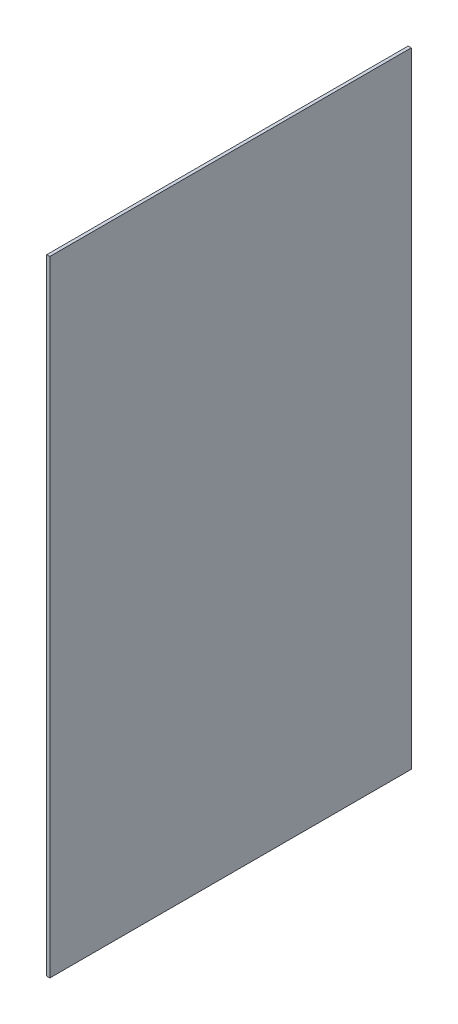
ISO-10303-21;
HEADER;
FILE_DESCRIPTION(('STEP AP214'),'2;1');
FILE_NAME('part.step','',(''),(''),'','','');
FILE_SCHEMA(('AUTOMOTIVE_DESIGN { 1 0 10303 214 1 1 1 1 }'));
ENDSEC;
DATA;
#1=APPLICATION_CONTEXT('core data for automotive mechanical design processes');
#2=APPLICATION_PROTOCOL_DEFINITION('international standard','automotive_design',2000,#1);
#3=PRODUCT_CONTEXT('',#1,'mechanical');
#4=PRODUCT('Part','Part','',(#3));
#5=PRODUCT_RELATED_PRODUCT_CATEGORY('part','',(#4));
#6=PRODUCT_DEFINITION_FORMATION('','',#4);
#7=PRODUCT_DEFINITION_CONTEXT('part definition',#1,'design');
#8=PRODUCT_DEFINITION('design','',#6,#7);
#9=PRODUCT_DEFINITION_SHAPE('','',#8);
#10=(LENGTH_UNIT() NAMED_UNIT(*) SI_UNIT(.MILLI.,.METRE.));
#11=(NAMED_UNIT(*) PLANE_ANGLE_UNIT() SI_UNIT($,.RADIAN.));
#12=(NAMED_UNIT(*) SI_UNIT($,.STERADIAN.) SOLID_ANGLE_UNIT());
#13=UNCERTAINTY_MEASURE_WITH_UNIT(LENGTH_MEASURE(1.E-05),#10,'distance_accuracy_value','');
#14=(GEOMETRIC_REPRESENTATION_CONTEXT(3) GLOBAL_UNCERTAINTY_ASSIGNED_CONTEXT((#13)) GLOBAL_UNIT_ASSIGNED_CONTEXT((#10,
#11,#12)) REPRESENTATION_CONTEXT('',''));
#15=CARTESIAN_POINT('',(0.,0.,0.));
#16=DIRECTION('',(0.,0.,1.));
#17=DIRECTION('',(1.,0.,0.));
#18=AXIS2_PLACEMENT_3D('',#15,#16,#17);
#19=CARTESIAN_POINT('',(3.4,-50.5656,30.16));
#20=DIRECTION('',(1.,0.,0.));
#21=DIRECTION('',(0.,0.,-1.));
#22=AXIS2_PLACEMENT_3D('',#19,#20,#21);
#23=PLANE('',#22);
#24=DIRECTION('',(0.,-1.,0.));
#25=VECTOR('',#24,1.);
#26=CARTESIAN_POINT('',(3.4,1.58,-29.));
#27=LINE('',#26,#25);
#28=CARTESIAN_POINT('',(3.4,-48.56,-29.));
#29=VERTEX_POINT('',#28);
#30=CARTESIAN_POINT('',(3.4,51.72,-29.));
#31=VERTEX_POINT('',#30);
#32=EDGE_CURVE('E76',#29,#31,#27,.F.);
#33=ORIENTED_EDGE('',*,*,#32,.T.);
#34=DIRECTION('',(0.,0.,-1.));
#35=VECTOR('',#34,1.);
#36=CARTESIAN_POINT('',(3.4,51.72,0.));
#37=LINE('',#36,#35);
#38=CARTESIAN_POINT('',(3.4,51.72,29.));
#39=VERTEX_POINT('',#38);
#40=EDGE_CURVE('E58',#31,#39,#37,.F.);
#41=ORIENTED_EDGE('',*,*,#40,.T.);
#42=DIRECTION('',(0.,1.,0.));
#43=VECTOR('',#42,1.);
#44=CARTESIAN_POINT('',(3.4,1.58,29.));
#45=LINE('',#44,#43);
#46=CARTESIAN_POINT('',(3.4,-48.56,29.));
#47=VERTEX_POINT('',#46);
#48=EDGE_CURVE('E20',#39,#47,#45,.F.);
#49=ORIENTED_EDGE('',*,*,#48,.T.);
#50=DIRECTION('',(0.,0.,1.));
#51=VECTOR('',#50,1.);
#52=CARTESIAN_POINT('',(3.4,-48.56,0.));
#53=LINE('',#52,#51);
#54=EDGE_CURVE('E55',#47,#29,#53,.F.);
#55=ORIENTED_EDGE('',*,*,#54,.T.);
#56=EDGE_LOOP('',(#33,#41,#49,#55));
#57=FACE_BOUND('',#56,.T.);
#58=ADVANCED_FACE('F16',(#57),#23,.T.);
#59=CARTESIAN_POINT('',(2.76098463072,53.7256,29.));
#60=DIRECTION('',(0.,0.,1.));
#61=DIRECTION('',(0.,-1.,0.));
#62=AXIS2_PLACEMENT_3D('',#59,#60,#61);
#63=PLANE('',#62);
#64=ORIENTED_EDGE('',*,*,#48,.F.);
#65=DIRECTION('',(1.,0.,0.));
#66=VECTOR('',#65,1.);
#67=CARTESIAN_POINT('',(3.15,51.72,29.));
#68=LINE('',#67,#66);
#69=CARTESIAN_POINT('',(2.9,51.72,29.));
#70=VERTEX_POINT('',#69);
#71=EDGE_CURVE('E80',#39,#70,#68,.F.);
#72=ORIENTED_EDGE('',*,*,#71,.T.);
#73=DIRECTION('',(0.,-1.,0.));
#74=VECTOR('',#73,1.);
#75=CARTESIAN_POINT('',(2.9,1.58,29.));
#76=LINE('',#75,#74);
#77=CARTESIAN_POINT('',(2.9,-48.56,29.));
#78=VERTEX_POINT('',#77);
#79=EDGE_CURVE('E73',#70,#78,#76,.T.);
#80=ORIENTED_EDGE('',*,*,#79,.T.);
#81=DIRECTION('',(-1.,0.,0.));
#82=VECTOR('',#81,1.);
#83=CARTESIAN_POINT('',(3.15,-48.56,29.));
#84=LINE('',#83,#82);
#85=EDGE_CURVE('E63',#78,#47,#84,.F.);
#86=ORIENTED_EDGE('',*,*,#85,.T.);
#87=EDGE_LOOP('',(#64,#72,#80,#86));
#88=FACE_BOUND('',#87,.T.);
#89=ADVANCED_FACE('F72',(#88),#63,.T.);
#90=CARTESIAN_POINT('',(2.76098463072,-48.56,30.16));
#91=DIRECTION('',(0.,-1.,0.));
#92=DIRECTION('',(0.,0.,-1.));
#93=AXIS2_PLACEMENT_3D('',#90,#91,#92);
#94=PLANE('',#93);
#95=ORIENTED_EDGE('',*,*,#54,.F.);
#96=ORIENTED_EDGE('',*,*,#85,.F.);
#97=DIRECTION('',(0.,0.,-1.));
#98=VECTOR('',#97,1.);
#99=CARTESIAN_POINT('',(2.9,-48.56,0.));
#100=LINE('',#99,#98);
#101=CARTESIAN_POINT('',(2.9,-48.56,-29.));
#102=VERTEX_POINT('',#101);
#103=EDGE_CURVE('E83',#78,#102,#100,.T.);
#104=ORIENTED_EDGE('',*,*,#103,.T.);
#105=DIRECTION('',(-1.,0.,0.));
#106=VECTOR('',#105,1.);
#107=CARTESIAN_POINT('',(3.15,-48.56,-29.));
#108=LINE('',#107,#106);
#109=EDGE_CURVE('E69',#102,#29,#108,.F.);
#110=ORIENTED_EDGE('',*,*,#109,.T.);
#111=EDGE_LOOP('',(#95,#96,#104,#110));
#112=FACE_BOUND('',#111,.T.);
#113=ADVANCED_FACE('F66',(#112),#94,.T.);
#114=CARTESIAN_POINT('',(2.76098463072,-50.5656,-29.));
#115=DIRECTION('',(0.,0.,-1.));
#116=DIRECTION('',(0.,1.,0.));
#117=AXIS2_PLACEMENT_3D('',#114,#115,#116);
#118=PLANE('',#117);
#119=ORIENTED_EDGE('',*,*,#32,.F.);
#120=ORIENTED_EDGE('',*,*,#109,.F.);
#121=DIRECTION('',(0.,1.,0.));
#122=VECTOR('',#121,1.);
#123=CARTESIAN_POINT('',(2.9,1.58,-29.));
#124=LINE('',#123,#122);
#125=CARTESIAN_POINT('',(2.9,51.72,-29.));
#126=VERTEX_POINT('',#125);
#127=EDGE_CURVE('E26',#102,#126,#124,.T.);
#128=ORIENTED_EDGE('',*,*,#127,.T.);
#129=DIRECTION('',(-1.,0.,0.));
#130=VECTOR('',#129,1.);
#131=CARTESIAN_POINT('',(3.15,51.72,-29.));
#132=LINE('',#131,#130);
#133=EDGE_CURVE('E34',#126,#31,#132,.F.);
#134=ORIENTED_EDGE('',*,*,#133,.T.);
#135=EDGE_LOOP('',(#119,#120,#128,#134));
#136=FACE_BOUND('',#135,.T.);
#137=ADVANCED_FACE('F88',(#136),#118,.T.);
#138=CARTESIAN_POINT('',(2.76098463072,51.72,-30.16));
#139=DIRECTION('',(0.,1.,0.));
#140=DIRECTION('',(0.,0.,1.));
#141=AXIS2_PLACEMENT_3D('',#138,#139,#140);
#142=PLANE('',#141);
#143=ORIENTED_EDGE('',*,*,#40,.F.);
#144=ORIENTED_EDGE('',*,*,#133,.F.);
#145=DIRECTION('',(0.,0.,1.));
#146=VECTOR('',#145,1.);
#147=CARTESIAN_POINT('',(2.9,51.72,0.));
#148=LINE('',#147,#146);
#149=EDGE_CURVE('E10',#126,#70,#148,.T.);
#150=ORIENTED_EDGE('',*,*,#149,.T.);
#151=ORIENTED_EDGE('',*,*,#71,.F.);
#152=EDGE_LOOP('',(#143,#144,#150,#151));
#153=FACE_BOUND('',#152,.T.);
#154=ADVANCED_FACE('F90',(#153),#142,.T.);
#155=CARTESIAN_POINT('',(2.9,-50.5656,30.16));
#156=DIRECTION('',(1.,0.,0.));
#157=DIRECTION('',(0.,0.,-1.));
#158=AXIS2_PLACEMENT_3D('',#155,#156,#157);
#159=PLANE('',#158);
#160=ORIENTED_EDGE('',*,*,#127,.F.);
#161=ORIENTED_EDGE('',*,*,#103,.F.);
#162=ORIENTED_EDGE('',*,*,#79,.F.);
#163=ORIENTED_EDGE('',*,*,#149,.F.);
#164=EDGE_LOOP('',(#160,#161,#162,#163));
#165=FACE_BOUND('',#164,.T.);
#166=ADVANCED_FACE('F18',(#165),#159,.F.);
#167=CLOSED_SHELL('',(#58,#89,#113,#137,#154,#166));
#168=MANIFOLD_SOLID_BREP('B1',#167);
#169=ADVANCED_BREP_SHAPE_REPRESENTATION('',(#18,#168),#14);
#170=SHAPE_DEFINITION_REPRESENTATION(#9,#169);
ENDSEC;
END-ISO-10303-21;
